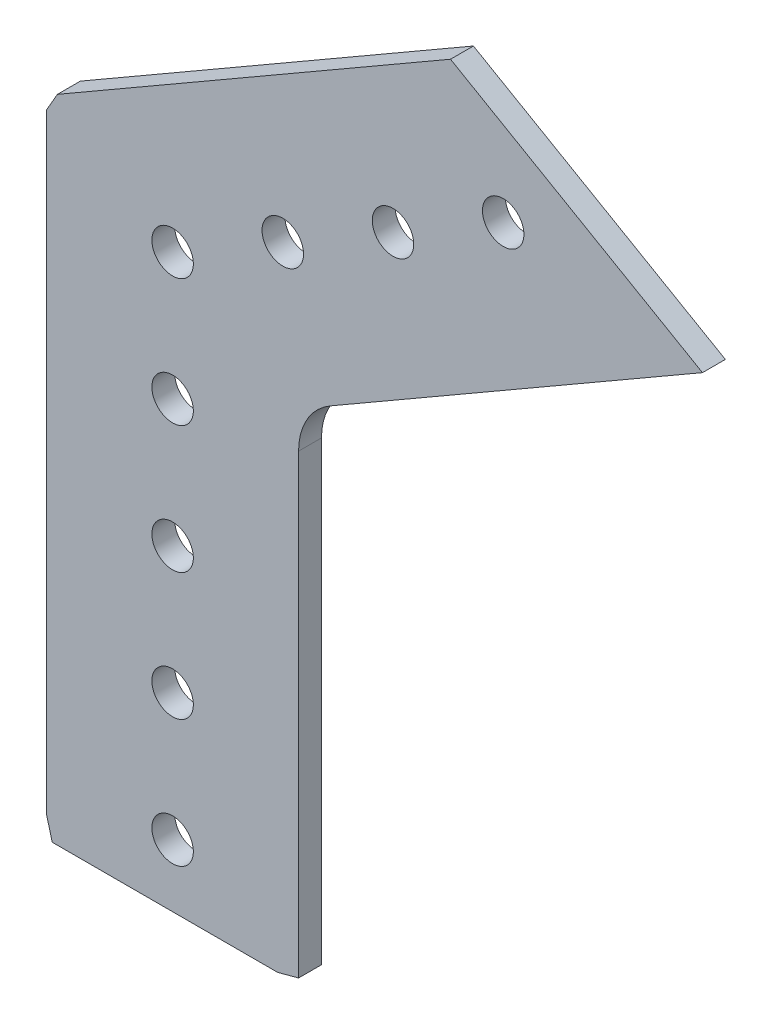
ISO-10303-21;
HEADER;
FILE_DESCRIPTION(('STEP AP214'),'2;1');
FILE_NAME('part.step','',(''),(''),'','','');
FILE_SCHEMA(('AUTOMOTIVE_DESIGN { 1 0 10303 214 1 1 1 1 }'));
ENDSEC;
DATA;
#1=APPLICATION_CONTEXT('core data for automotive mechanical design processes');
#2=APPLICATION_PROTOCOL_DEFINITION('international standard','automotive_design',2000,#1);
#3=PRODUCT_CONTEXT('',#1,'mechanical');
#4=PRODUCT('Part','Part','',(#3));
#5=PRODUCT_RELATED_PRODUCT_CATEGORY('part','',(#4));
#6=PRODUCT_DEFINITION_FORMATION('','',#4);
#7=PRODUCT_DEFINITION_CONTEXT('part definition',#1,'design');
#8=PRODUCT_DEFINITION('design','',#6,#7);
#9=PRODUCT_DEFINITION_SHAPE('','',#8);
#10=(LENGTH_UNIT() NAMED_UNIT(*) SI_UNIT(.MILLI.,.METRE.));
#11=(NAMED_UNIT(*) PLANE_ANGLE_UNIT() SI_UNIT($,.RADIAN.));
#12=(NAMED_UNIT(*) SI_UNIT($,.STERADIAN.) SOLID_ANGLE_UNIT());
#13=UNCERTAINTY_MEASURE_WITH_UNIT(LENGTH_MEASURE(1.E-05),#10,'distance_accuracy_value','');
#14=(GEOMETRIC_REPRESENTATION_CONTEXT(3) GLOBAL_UNCERTAINTY_ASSIGNED_CONTEXT((#13)) GLOBAL_UNIT_ASSIGNED_CONTEXT((#10,
#11,#12)) REPRESENTATION_CONTEXT('',''));
#15=CARTESIAN_POINT('',(0.,0.,0.));
#16=DIRECTION('',(0.,0.,1.));
#17=DIRECTION('',(1.,0.,0.));
#18=AXIS2_PLACEMENT_3D('',#15,#16,#17);
#19=CARTESIAN_POINT('',(0.,0.,2.286));
#20=DIRECTION('',(0.,0.,1.));
#21=DIRECTION('',(1.,0.,0.));
#22=AXIS2_PLACEMENT_3D('',#19,#20,#21);
#23=PLANE('',#22);
#24=CARTESIAN_POINT('',(21.9970452561238,12.7,2.286));
#25=DIRECTION('',(0.,0.,-1.));
#26=DIRECTION('',(-1.,0.,0.));
#27=AXIS2_PLACEMENT_3D('',#24,#25,#26);
#28=CIRCLE('',#27,2.0701);
#29=CARTESIAN_POINT('',(19.9269452561238,12.7,2.286));
#30=VERTEX_POINT('',#29);
#31=EDGE_CURVE('E183',#30,#30,#28,.T.);
#32=ORIENTED_EDGE('',*,*,#31,.T.);
#33=EDGE_LOOP('',(#32));
#34=FACE_BOUND('',#33,.T.);
#35=CARTESIAN_POINT('',(0.,0.,2.286));
#36=DIRECTION('',(0.,0.,-1.));
#37=DIRECTION('',(-1.,0.,0.));
#38=AXIS2_PLACEMENT_3D('',#35,#36,#37);
#39=CIRCLE('',#38,2.0701);
#40=CARTESIAN_POINT('',(-2.0701,0.,2.286));
#41=VERTEX_POINT('',#40);
#42=EDGE_CURVE('E186',#41,#41,#39,.T.);
#43=ORIENTED_EDGE('',*,*,#42,.T.);
#44=EDGE_LOOP('',(#43));
#45=FACE_BOUND('',#44,.T.);
#46=CARTESIAN_POINT('',(3.99076317029666E-13,-38.1,2.286));
#47=DIRECTION('',(0.,0.,-1.));
#48=DIRECTION('',(-1.,0.,0.));
#49=AXIS2_PLACEMENT_3D('',#46,#47,#48);
#50=CIRCLE('',#49,2.0701);
#51=CARTESIAN_POINT('',(-2.0700999999996,-38.1,2.286));
#52=VERTEX_POINT('',#51);
#53=EDGE_CURVE('E189',#52,#52,#50,.T.);
#54=ORIENTED_EDGE('',*,*,#53,.T.);
#55=EDGE_LOOP('',(#54));
#56=FACE_BOUND('',#55,.T.);
#57=CARTESIAN_POINT('',(0.,-12.7,2.286));
#58=DIRECTION('',(0.,0.,-1.));
#59=DIRECTION('',(-1.,0.,0.));
#60=AXIS2_PLACEMENT_3D('',#57,#58,#59);
#61=CIRCLE('',#60,2.0701);
#62=CARTESIAN_POINT('',(-2.0701,-12.7,2.286));
#63=VERTEX_POINT('',#62);
#64=EDGE_CURVE('E192',#63,#63,#61,.T.);
#65=ORIENTED_EDGE('',*,*,#64,.T.);
#66=EDGE_LOOP('',(#65));
#67=FACE_BOUND('',#66,.T.);
#68=CARTESIAN_POINT('',(2.66050878019862E-13,-25.4,2.286));
#69=DIRECTION('',(0.,0.,-1.));
#70=DIRECTION('',(-1.,0.,0.));
#71=AXIS2_PLACEMENT_3D('',#68,#69,#70);
#72=CIRCLE('',#71,2.0701);
#73=CARTESIAN_POINT('',(-2.07009999999973,-25.4,2.286));
#74=VERTEX_POINT('',#73);
#75=EDGE_CURVE('E195',#74,#74,#72,.T.);
#76=ORIENTED_EDGE('',*,*,#75,.T.);
#77=EDGE_LOOP('',(#76));
#78=FACE_BOUND('',#77,.T.);
#79=CARTESIAN_POINT('',(0.,-50.8,2.286));
#80=DIRECTION('',(0.,0.,-1.));
#81=DIRECTION('',(-1.,0.,0.));
#82=AXIS2_PLACEMENT_3D('',#79,#80,#81);
#83=CIRCLE('',#82,2.0701);
#84=CARTESIAN_POINT('',(-2.0701,-50.8,2.286));
#85=VERTEX_POINT('',#84);
#86=EDGE_CURVE('E198',#85,#85,#83,.T.);
#87=ORIENTED_EDGE('',*,*,#86,.T.);
#88=EDGE_LOOP('',(#87));
#89=FACE_BOUND('',#88,.T.);
#90=CARTESIAN_POINT('',(32.9955678841958,19.05,2.286));
#91=DIRECTION('',(0.,0.,-1.));
#92=DIRECTION('',(-1.,0.,0.));
#93=AXIS2_PLACEMENT_3D('',#90,#91,#92);
#94=CIRCLE('',#93,2.0701);
#95=CARTESIAN_POINT('',(30.9254678841958,19.05,2.286));
#96=VERTEX_POINT('',#95);
#97=EDGE_CURVE('E201',#96,#96,#94,.T.);
#98=ORIENTED_EDGE('',*,*,#97,.T.);
#99=EDGE_LOOP('',(#98));
#100=FACE_BOUND('',#99,.T.);
#101=CARTESIAN_POINT('',(10.9985226280619,6.35,2.286));
#102=DIRECTION('',(0.,0.,-1.));
#103=DIRECTION('',(-1.,0.,0.));
#104=AXIS2_PLACEMENT_3D('',#101,#102,#103);
#105=CIRCLE('',#104,2.0701);
#106=CARTESIAN_POINT('',(8.92842262806188,6.35,2.286));
#107=VERTEX_POINT('',#106);
#108=EDGE_CURVE('E123',#107,#107,#105,.T.);
#109=ORIENTED_EDGE('',*,*,#108,.T.);
#110=EDGE_LOOP('',(#109));
#111=FACE_BOUND('',#110,.T.);
#112=DIRECTION('',(-0.866025403784429,-0.500000000000017,0.));
#113=VECTOR('',#112,1.);
#114=CARTESIAN_POINT('',(12.573,-7.25902493452206,2.286));
#115=LINE('',#114,#113);
#116=CARTESIAN_POINT('',(15.7479999999999,-5.42593782984496,2.286));
#117=VERTEX_POINT('',#116);
#118=CARTESIAN_POINT('',(52.8832839420883,16.0141283505576,2.286));
#119=VERTEX_POINT('',#118);
#120=EDGE_CURVE('E97',#117,#119,#115,.F.);
#121=ORIENTED_EDGE('',*,*,#120,.T.);
#122=DIRECTION('',(0.866025403784429,-0.500000000000017,0.));
#123=VECTOR('',#122,1.);
#124=CARTESIAN_POINT('',(62.2844715234926,10.5863501697414,2.286));
#125=LINE('',#124,#123);
#126=CARTESIAN_POINT('',(27.73728394209,30.5321782195957,2.286));
#127=VERTEX_POINT('',#126);
#128=EDGE_CURVE('E93',#119,#127,#125,.F.);
#129=ORIENTED_EDGE('',*,*,#128,.T.);
#130=DIRECTION('',(0.866025403784429,0.500000000000017,0.));
#131=VECTOR('',#130,1.);
#132=CARTESIAN_POINT('',(43.0968665999984,39.4000374017742,2.286));
#133=LINE('',#132,#131);
#134=CARTESIAN_POINT('',(-11.4934999999996,7.88227455010915,2.286));
#135=VERTEX_POINT('',#134);
#136=EDGE_CURVE('E95',#127,#135,#133,.F.);
#137=ORIENTED_EDGE('',*,*,#136,.T.);
#138=DIRECTION('',(0.500000000000017,0.866025403784429,0.));
#139=VECTOR('',#138,1.);
#140=CARTESIAN_POINT('',(-12.573,6.01252570334212,2.286));
#141=LINE('',#140,#139);
#142=CARTESIAN_POINT('',(-12.573,6.01252570334212,2.286));
#143=VERTEX_POINT('',#142);
#144=EDGE_CURVE('E109',#135,#143,#141,.F.);
#145=ORIENTED_EDGE('',*,*,#144,.T.);
#146=DIRECTION('',(0.,1.,0.));
#147=VECTOR('',#146,1.);
#148=CARTESIAN_POINT('',(-12.573,-57.023,2.286));
#149=LINE('',#148,#147);
#150=CARTESIAN_POINT('',(-12.573,-54.937566141031,2.286));
#151=VERTEX_POINT('',#150);
#152=EDGE_CURVE('E145',#143,#151,#149,.F.);
#153=ORIENTED_EDGE('',*,*,#152,.T.);
#154=DIRECTION('',(-0.258819045102493,0.965925826289076,0.));
#155=VECTOR('',#154,1.);
#156=CARTESIAN_POINT('',(-12.573,-54.937566141031,2.286));
#157=LINE('',#156,#155);
#158=CARTESIAN_POINT('',(-12.014209681623,-57.0229999999997,2.286));
#159=VERTEX_POINT('',#158);
#160=EDGE_CURVE('E142',#151,#159,#157,.F.);
#161=ORIENTED_EDGE('',*,*,#160,.T.);
#162=DIRECTION('',(1.,0.,0.));
#163=VECTOR('',#162,1.);
#164=CARTESIAN_POINT('',(12.573,-57.023,2.286));
#165=LINE('',#164,#163);
#166=CARTESIAN_POINT('',(10.4875661410412,-57.023,2.286));
#167=VERTEX_POINT('',#166);
#168=EDGE_CURVE('E135',#159,#167,#165,.T.);
#169=ORIENTED_EDGE('',*,*,#168,.T.);
#170=DIRECTION('',(-0.965925826289076,-0.258819045102493,0.));
#171=VECTOR('',#170,1.);
#172=CARTESIAN_POINT('',(10.4875661410412,-57.023,2.286));
#173=LINE('',#172,#171);
#174=CARTESIAN_POINT('',(12.5730000000006,-56.4642096816186,2.286));
#175=VERTEX_POINT('',#174);
#176=EDGE_CURVE('E54',#167,#175,#173,.F.);
#177=ORIENTED_EDGE('',*,*,#176,.T.);
#178=DIRECTION('',(0.,1.,0.));
#179=VECTOR('',#178,1.);
#180=CARTESIAN_POINT('',(12.573,-7.25902493452206,2.286));
#181=LINE('',#180,#179);
#182=CARTESIAN_POINT('',(12.573,-10.925199143876,2.286));
#183=VERTEX_POINT('',#182);
#184=EDGE_CURVE('E128',#175,#183,#181,.T.);
#185=ORIENTED_EDGE('',*,*,#184,.T.);
#186=CARTESIAN_POINT('',(18.923,-10.925199143876,2.286));
#187=DIRECTION('',(0.,0.,1.));
#188=DIRECTION('',(1.,0.,0.));
#189=AXIS2_PLACEMENT_3D('',#186,#187,#188);
#190=CIRCLE('',#189,6.35);
#191=EDGE_CURVE('E19',#183,#117,#190,.F.);
#192=ORIENTED_EDGE('',*,*,#191,.T.);
#193=EDGE_LOOP('',(#121,#129,#137,#145,#153,#161,#169,#177,#185,#192));
#194=FACE_BOUND('',#193,.T.);
#195=ADVANCED_FACE('F16',(#34,#45,#56,#67,#78,#89,#100,#111,#194),#23,.T.);
#196=CARTESIAN_POINT('',(62.2844715234926,10.5863501697414,0.));
#197=DIRECTION('',(-0.500000000000017,-0.866025403784429,0.));
#198=DIRECTION('',(0.866025403784429,-0.500000000000017,0.));
#199=AXIS2_PLACEMENT_3D('',#196,#197,#198);
#200=PLANE('',#199);
#201=DIRECTION('',(-0.866025403784488,0.499999999999915,0.));
#202=VECTOR('',#201,1.);
#203=CARTESIAN_POINT('',(52.8832839420852,16.0141283505566,0.));
#204=LINE('',#203,#202);
#205=CARTESIAN_POINT('',(52.8832839420858,16.0141283505554,0.));
#206=VERTEX_POINT('',#205);
#207=CARTESIAN_POINT('',(27.7372839420864,30.5321782195935,0.));
#208=VERTEX_POINT('',#207);
#209=EDGE_CURVE('E114',#206,#208,#204,.T.);
#210=ORIENTED_EDGE('',*,*,#209,.T.);
#211=DIRECTION('',(0.,0.,1.));
#212=VECTOR('',#211,1.);
#213=CARTESIAN_POINT('',(27.7372839420888,30.5321782195894,2.286));
#214=LINE('',#213,#212);
#215=EDGE_CURVE('E102',#208,#127,#214,.T.);
#216=ORIENTED_EDGE('',*,*,#215,.T.);
#217=ORIENTED_EDGE('',*,*,#128,.F.);
#218=DIRECTION('',(0.,0.,1.));
#219=VECTOR('',#218,1.);
#220=CARTESIAN_POINT('',(52.8832839420871,16.0141283505532,2.286));
#221=LINE('',#220,#219);
#222=EDGE_CURVE('E335',#119,#206,#221,.F.);
#223=ORIENTED_EDGE('',*,*,#222,.T.);
#224=EDGE_LOOP('',(#210,#216,#217,#223));
#225=FACE_BOUND('',#224,.T.);
#226=ADVANCED_FACE('F112',(#225),#200,.F.);
#227=CARTESIAN_POINT('',(43.0968665999984,39.4000374017742,2.286));
#228=DIRECTION('',(0.500000000000017,-0.866025403784429,0.));
#229=DIRECTION('',(0.866025403784429,0.500000000000017,0.));
#230=AXIS2_PLACEMENT_3D('',#227,#228,#229);
#231=PLANE('',#230);
#232=DIRECTION('',(0.,0.,1.));
#233=VECTOR('',#232,1.);
#234=CARTESIAN_POINT('',(-11.4935000000008,7.88227455011123,2.286));
#235=LINE('',#234,#233);
#236=CARTESIAN_POINT('',(-11.4935000000003,7.8822745501109,0.));
#237=VERTEX_POINT('',#236);
#238=EDGE_CURVE('E108',#237,#135,#235,.T.);
#239=ORIENTED_EDGE('',*,*,#238,.T.);
#240=ORIENTED_EDGE('',*,*,#136,.F.);
#241=ORIENTED_EDGE('',*,*,#215,.F.);
#242=DIRECTION('',(-0.866025403784421,-0.500000000000031,0.));
#243=VECTOR('',#242,1.);
#244=CARTESIAN_POINT('',(27.7372839420852,30.5321782195956,0.));
#245=LINE('',#244,#243);
#246=EDGE_CURVE('E340',#208,#237,#245,.T.);
#247=ORIENTED_EDGE('',*,*,#246,.T.);
#248=EDGE_LOOP('',(#239,#240,#241,#247));
#249=FACE_BOUND('',#248,.T.);
#250=ADVANCED_FACE('F105',(#249),#231,.F.);
#251=CARTESIAN_POINT('',(-12.573,6.01252570334212,2.286));
#252=DIRECTION('',(0.866025403784429,-0.500000000000017,0.));
#253=DIRECTION('',(0.500000000000017,0.866025403784429,0.));
#254=AXIS2_PLACEMENT_3D('',#251,#252,#253);
#255=PLANE('',#254);
#256=DIRECTION('',(-0.500000000000393,-0.866025403784212,0.));
#257=VECTOR('',#256,1.);
#258=CARTESIAN_POINT('',(-11.4935,7.88227455011076,0.));
#259=LINE('',#258,#257);
#260=CARTESIAN_POINT('',(-12.573,6.01252570334212,0.));
#261=VERTEX_POINT('',#260);
#262=EDGE_CURVE('E373',#237,#261,#259,.T.);
#263=ORIENTED_EDGE('',*,*,#262,.T.);
#264=DIRECTION('',(0.,0.,-1.));
#265=VECTOR('',#264,1.);
#266=CARTESIAN_POINT('',(-12.573,6.01252570334212,2.286));
#267=LINE('',#266,#265);
#268=EDGE_CURVE('E150',#261,#143,#267,.F.);
#269=ORIENTED_EDGE('',*,*,#268,.T.);
#270=ORIENTED_EDGE('',*,*,#144,.F.);
#271=ORIENTED_EDGE('',*,*,#238,.F.);
#272=EDGE_LOOP('',(#263,#269,#270,#271));
#273=FACE_BOUND('',#272,.T.);
#274=ADVANCED_FACE('F285',(#273),#255,.F.);
#275=CARTESIAN_POINT('',(-12.573,-57.023,2.286));
#276=DIRECTION('',(1.,0.,0.));
#277=DIRECTION('',(0.,0.,-1.));
#278=AXIS2_PLACEMENT_3D('',#275,#276,#277);
#279=PLANE('',#278);
#280=ORIENTED_EDGE('',*,*,#268,.F.);
#281=DIRECTION('',(0.,1.,0.));
#282=VECTOR('',#281,1.);
#283=CARTESIAN_POINT('',(-12.573,0.,0.));
#284=LINE('',#283,#282);
#285=CARTESIAN_POINT('',(-12.573,-54.9375661410309,0.));
#286=VERTEX_POINT('',#285);
#287=EDGE_CURVE('E364',#261,#286,#284,.F.);
#288=ORIENTED_EDGE('',*,*,#287,.T.);
#289=DIRECTION('',(0.,0.,1.));
#290=VECTOR('',#289,1.);
#291=CARTESIAN_POINT('',(-12.573,-54.937566141031,2.286));
#292=LINE('',#291,#290);
#293=EDGE_CURVE('E144',#286,#151,#292,.T.);
#294=ORIENTED_EDGE('',*,*,#293,.T.);
#295=ORIENTED_EDGE('',*,*,#152,.F.);
#296=EDGE_LOOP('',(#280,#288,#294,#295));
#297=FACE_BOUND('',#296,.T.);
#298=ADVANCED_FACE('F290',(#297),#279,.F.);
#299=CARTESIAN_POINT('',(-12.573,-54.937566141031,2.286));
#300=DIRECTION('',(0.965925826289076,0.258819045102493,0.));
#301=DIRECTION('',(-0.258819045102493,0.965925826289076,0.));
#302=AXIS2_PLACEMENT_3D('',#299,#300,#301);
#303=PLANE('',#302);
#304=DIRECTION('',(0.258819045101101,-0.965925826289449,0.));
#305=VECTOR('',#304,1.);
#306=CARTESIAN_POINT('',(-12.573,-54.937566141031,0.));
#307=LINE('',#306,#305);
#308=CARTESIAN_POINT('',(-12.014209681624,-57.023,0.));
#309=VERTEX_POINT('',#308);
#310=EDGE_CURVE('E355',#286,#309,#307,.T.);
#311=ORIENTED_EDGE('',*,*,#310,.T.);
#312=DIRECTION('',(0.,0.,1.));
#313=VECTOR('',#312,1.);
#314=CARTESIAN_POINT('',(-12.014209681624,-57.023,2.286));
#315=LINE('',#314,#313);
#316=EDGE_CURVE('E139',#309,#159,#315,.T.);
#317=ORIENTED_EDGE('',*,*,#316,.T.);
#318=ORIENTED_EDGE('',*,*,#160,.F.);
#319=ORIENTED_EDGE('',*,*,#293,.F.);
#320=EDGE_LOOP('',(#311,#317,#318,#319));
#321=FACE_BOUND('',#320,.T.);
#322=ADVANCED_FACE('F294',(#321),#303,.F.);
#323=CARTESIAN_POINT('',(12.573,-57.023,2.286));
#324=DIRECTION('',(0.,1.,0.));
#325=DIRECTION('',(0.,0.,1.));
#326=AXIS2_PLACEMENT_3D('',#323,#324,#325);
#327=PLANE('',#326);
#328=DIRECTION('',(0.,0.,1.));
#329=VECTOR('',#328,1.);
#330=CARTESIAN_POINT('',(10.4875661410412,-57.023,2.286));
#331=LINE('',#330,#329);
#332=CARTESIAN_POINT('',(10.4875661410412,-57.023,0.));
#333=VERTEX_POINT('',#332);
#334=EDGE_CURVE('E134',#333,#167,#331,.T.);
#335=ORIENTED_EDGE('',*,*,#334,.T.);
#336=ORIENTED_EDGE('',*,*,#168,.F.);
#337=ORIENTED_EDGE('',*,*,#316,.F.);
#338=DIRECTION('',(1.,0.,0.));
#339=VECTOR('',#338,1.);
#340=CARTESIAN_POINT('',(0.,-57.023,0.));
#341=LINE('',#340,#339);
#342=EDGE_CURVE('E326',#309,#333,#341,.T.);
#343=ORIENTED_EDGE('',*,*,#342,.T.);
#344=EDGE_LOOP('',(#335,#336,#337,#343));
#345=FACE_BOUND('',#344,.T.);
#346=ADVANCED_FACE('F298',(#345),#327,.F.);
#347=CARTESIAN_POINT('',(10.4875661410412,-57.023,2.286));
#348=DIRECTION('',(-0.258819045102493,0.965925826289076,0.));
#349=DIRECTION('',(-0.965925826289076,-0.258819045102493,0.));
#350=AXIS2_PLACEMENT_3D('',#347,#348,#349);
#351=PLANE('',#350);
#352=DIRECTION('',(0.965925826288251,0.258819045105572,0.));
#353=VECTOR('',#352,1.);
#354=CARTESIAN_POINT('',(10.4875661410412,-57.023,0.));
#355=LINE('',#354,#353);
#356=CARTESIAN_POINT('',(12.573,-56.4642096816164,0.));
#357=VERTEX_POINT('',#356);
#358=EDGE_CURVE('E324',#333,#357,#355,.T.);
#359=ORIENTED_EDGE('',*,*,#358,.T.);
#360=DIRECTION('',(0.,0.,1.));
#361=VECTOR('',#360,1.);
#362=CARTESIAN_POINT('',(12.573,-56.4642096816164,2.286));
#363=LINE('',#362,#361);
#364=EDGE_CURVE('E130',#357,#175,#363,.T.);
#365=ORIENTED_EDGE('',*,*,#364,.T.);
#366=ORIENTED_EDGE('',*,*,#176,.F.);
#367=ORIENTED_EDGE('',*,*,#334,.F.);
#368=EDGE_LOOP('',(#359,#365,#366,#367));
#369=FACE_BOUND('',#368,.T.);
#370=ADVANCED_FACE('F302',(#369),#351,.F.);
#371=CARTESIAN_POINT('',(12.573,-7.25902493452206,2.286));
#372=DIRECTION('',(-1.,0.,0.));
#373=DIRECTION('',(0.,0.,1.));
#374=AXIS2_PLACEMENT_3D('',#371,#372,#373);
#375=PLANE('',#374);
#376=DIRECTION('',(0.,0.,1.));
#377=VECTOR('',#376,1.);
#378=CARTESIAN_POINT('',(12.573,-10.925199143876,2.286));
#379=LINE('',#378,#377);
#380=CARTESIAN_POINT('',(12.573,-10.925199143876,0.));
#381=VERTEX_POINT('',#380);
#382=EDGE_CURVE('E316',#381,#183,#379,.T.);
#383=ORIENTED_EDGE('',*,*,#382,.T.);
#384=ORIENTED_EDGE('',*,*,#184,.F.);
#385=ORIENTED_EDGE('',*,*,#364,.F.);
#386=DIRECTION('',(0.,1.,0.));
#387=VECTOR('',#386,1.);
#388=CARTESIAN_POINT('',(12.573,0.,0.));
#389=LINE('',#388,#387);
#390=EDGE_CURVE('E182',#357,#381,#389,.T.);
#391=ORIENTED_EDGE('',*,*,#390,.T.);
#392=EDGE_LOOP('',(#383,#384,#385,#391));
#393=FACE_BOUND('',#392,.T.);
#394=ADVANCED_FACE('F306',(#393),#375,.F.);
#395=CARTESIAN_POINT('',(18.923,-10.925199143876,2.286));
#396=DIRECTION('',(0.,0.,1.));
#397=DIRECTION('',(1.,0.,0.));
#398=AXIS2_PLACEMENT_3D('',#395,#396,#397);
#399=CYLINDRICAL_SURFACE('',#398,6.35);
#400=CARTESIAN_POINT('',(18.923,-10.925199143876,0.));
#401=DIRECTION('',(0.,0.,1.));
#402=DIRECTION('',(1.,0.,0.));
#403=AXIS2_PLACEMENT_3D('',#400,#401,#402);
#404=CIRCLE('',#403,6.35);
#405=CARTESIAN_POINT('',(15.7479999999997,-5.42593782984517,0.));
#406=VERTEX_POINT('',#405);
#407=EDGE_CURVE('E179',#381,#406,#404,.F.);
#408=ORIENTED_EDGE('',*,*,#407,.T.);
#409=DIRECTION('',(0.,0.,1.));
#410=VECTOR('',#409,1.);
#411=CARTESIAN_POINT('',(15.7479999999999,-5.42593782984496,2.286));
#412=LINE('',#411,#410);
#413=EDGE_CURVE('E34',#406,#117,#412,.T.);
#414=ORIENTED_EDGE('',*,*,#413,.T.);
#415=ORIENTED_EDGE('',*,*,#191,.F.);
#416=ORIENTED_EDGE('',*,*,#382,.F.);
#417=EDGE_LOOP('',(#408,#414,#415,#416));
#418=FACE_BOUND('',#417,.T.);
#419=ADVANCED_FACE('F221',(#418),#399,.F.);
#420=CARTESIAN_POINT('',(12.573,-7.25902493452206,2.286));
#421=DIRECTION('',(-0.500000000000017,0.866025403784429,0.));
#422=DIRECTION('',(-0.866025403784429,-0.500000000000017,0.));
#423=AXIS2_PLACEMENT_3D('',#420,#421,#422);
#424=PLANE('',#423);
#425=ORIENTED_EDGE('',*,*,#413,.F.);
#426=DIRECTION('',(0.866025403784383,0.500000000000097,0.));
#427=VECTOR('',#426,1.);
#428=CARTESIAN_POINT('',(15.748,-5.42593782984508,0.));
#429=LINE('',#428,#427);
#430=EDGE_CURVE('E178',#406,#206,#429,.T.);
#431=ORIENTED_EDGE('',*,*,#430,.T.);
#432=ORIENTED_EDGE('',*,*,#222,.F.);
#433=ORIENTED_EDGE('',*,*,#120,.F.);
#434=EDGE_LOOP('',(#425,#431,#432,#433));
#435=FACE_BOUND('',#434,.T.);
#436=ADVANCED_FACE('F210',(#435),#424,.F.);
#437=CARTESIAN_POINT('',(10.9985226280619,6.35,2.286));
#438=DIRECTION('',(0.,0.,-1.));
#439=DIRECTION('',(-1.,0.,0.));
#440=AXIS2_PLACEMENT_3D('',#437,#438,#439);
#441=CYLINDRICAL_SURFACE('',#440,2.0701);
#442=CARTESIAN_POINT('',(10.9985226280619,6.35,0.));
#443=DIRECTION('',(0.,0.,-1.));
#444=DIRECTION('',(-1.,0.,0.));
#445=AXIS2_PLACEMENT_3D('',#442,#443,#444);
#446=CIRCLE('',#445,2.0701);
#447=CARTESIAN_POINT('',(8.92842262806188,6.35,0.));
#448=VERTEX_POINT('',#447);
#449=EDGE_CURVE('E175',#448,#448,#446,.T.);
#450=ORIENTED_EDGE('',*,*,#449,.T.);
#451=EDGE_LOOP('',(#450));
#452=FACE_BOUND('',#451,.T.);
#453=ORIENTED_EDGE('',*,*,#108,.F.);
#454=EDGE_LOOP('',(#453));
#455=FACE_BOUND('',#454,.T.);
#456=ADVANCED_FACE('F207',(#452,#455),#441,.F.);
#457=CARTESIAN_POINT('',(32.9955678841958,19.05,2.286));
#458=DIRECTION('',(0.,0.,-1.));
#459=DIRECTION('',(-1.,0.,0.));
#460=AXIS2_PLACEMENT_3D('',#457,#458,#459);
#461=CYLINDRICAL_SURFACE('',#460,2.0701);
#462=CARTESIAN_POINT('',(32.9955678841958,19.05,0.));
#463=DIRECTION('',(0.,0.,-1.));
#464=DIRECTION('',(-1.,0.,0.));
#465=AXIS2_PLACEMENT_3D('',#462,#463,#464);
#466=CIRCLE('',#465,2.0701);
#467=CARTESIAN_POINT('',(30.9254678841958,19.05,0.));
#468=VERTEX_POINT('',#467);
#469=EDGE_CURVE('E172',#468,#468,#466,.T.);
#470=ORIENTED_EDGE('',*,*,#469,.T.);
#471=EDGE_LOOP('',(#470));
#472=FACE_BOUND('',#471,.T.);
#473=ORIENTED_EDGE('',*,*,#97,.F.);
#474=EDGE_LOOP('',(#473));
#475=FACE_BOUND('',#474,.T.);
#476=ADVANCED_FACE('F209',(#472,#475),#461,.F.);
#477=CARTESIAN_POINT('',(0.,-50.8,2.286));
#478=DIRECTION('',(0.,0.,-1.));
#479=DIRECTION('',(-1.,0.,0.));
#480=AXIS2_PLACEMENT_3D('',#477,#478,#479);
#481=CYLINDRICAL_SURFACE('',#480,2.0701);
#482=CARTESIAN_POINT('',(0.,-50.8,0.));
#483=DIRECTION('',(0.,0.,-1.));
#484=DIRECTION('',(-1.,0.,0.));
#485=AXIS2_PLACEMENT_3D('',#482,#483,#484);
#486=CIRCLE('',#485,2.0701);
#487=CARTESIAN_POINT('',(-2.0701,-50.8,0.));
#488=VERTEX_POINT('',#487);
#489=EDGE_CURVE('E169',#488,#488,#486,.T.);
#490=ORIENTED_EDGE('',*,*,#489,.T.);
#491=EDGE_LOOP('',(#490));
#492=FACE_BOUND('',#491,.T.);
#493=ORIENTED_EDGE('',*,*,#86,.F.);
#494=EDGE_LOOP('',(#493));
#495=FACE_BOUND('',#494,.T.);
#496=ADVANCED_FACE('F218',(#492,#495),#481,.F.);
#497=CARTESIAN_POINT('',(2.66050878019862E-13,-25.4,2.286));
#498=DIRECTION('',(0.,0.,-1.));
#499=DIRECTION('',(-1.,0.,0.));
#500=AXIS2_PLACEMENT_3D('',#497,#498,#499);
#501=CYLINDRICAL_SURFACE('',#500,2.0701);
#502=CARTESIAN_POINT('',(2.66050878019862E-13,-25.4,0.));
#503=DIRECTION('',(0.,0.,-1.));
#504=DIRECTION('',(-1.,0.,0.));
#505=AXIS2_PLACEMENT_3D('',#502,#503,#504);
#506=CIRCLE('',#505,2.0701);
#507=CARTESIAN_POINT('',(-2.07009999999973,-25.4,0.));
#508=VERTEX_POINT('',#507);
#509=EDGE_CURVE('E166',#508,#508,#506,.T.);
#510=ORIENTED_EDGE('',*,*,#509,.T.);
#511=EDGE_LOOP('',(#510));
#512=FACE_BOUND('',#511,.T.);
#513=ORIENTED_EDGE('',*,*,#75,.F.);
#514=EDGE_LOOP('',(#513));
#515=FACE_BOUND('',#514,.T.);
#516=ADVANCED_FACE('F247',(#512,#515),#501,.F.);
#517=CARTESIAN_POINT('',(0.,-12.7,2.286));
#518=DIRECTION('',(0.,0.,-1.));
#519=DIRECTION('',(-1.,0.,0.));
#520=AXIS2_PLACEMENT_3D('',#517,#518,#519);
#521=CYLINDRICAL_SURFACE('',#520,2.0701);
#522=CARTESIAN_POINT('',(0.,-12.7,0.));
#523=DIRECTION('',(0.,0.,-1.));
#524=DIRECTION('',(-1.,0.,0.));
#525=AXIS2_PLACEMENT_3D('',#522,#523,#524);
#526=CIRCLE('',#525,2.0701);
#527=CARTESIAN_POINT('',(-2.0701,-12.7,0.));
#528=VERTEX_POINT('',#527);
#529=EDGE_CURVE('E163',#528,#528,#526,.T.);
#530=ORIENTED_EDGE('',*,*,#529,.T.);
#531=EDGE_LOOP('',(#530));
#532=FACE_BOUND('',#531,.T.);
#533=ORIENTED_EDGE('',*,*,#64,.F.);
#534=EDGE_LOOP('',(#533));
#535=FACE_BOUND('',#534,.T.);
#536=ADVANCED_FACE('F243',(#532,#535),#521,.F.);
#537=CARTESIAN_POINT('',(3.99076317029666E-13,-38.1,2.286));
#538=DIRECTION('',(0.,0.,-1.));
#539=DIRECTION('',(-1.,0.,0.));
#540=AXIS2_PLACEMENT_3D('',#537,#538,#539);
#541=CYLINDRICAL_SURFACE('',#540,2.0701);
#542=CARTESIAN_POINT('',(3.99076317029666E-13,-38.1,0.));
#543=DIRECTION('',(0.,0.,-1.));
#544=DIRECTION('',(-1.,0.,0.));
#545=AXIS2_PLACEMENT_3D('',#542,#543,#544);
#546=CIRCLE('',#545,2.0701);
#547=CARTESIAN_POINT('',(-2.0700999999996,-38.1,0.));
#548=VERTEX_POINT('',#547);
#549=EDGE_CURVE('E160',#548,#548,#546,.T.);
#550=ORIENTED_EDGE('',*,*,#549,.T.);
#551=EDGE_LOOP('',(#550));
#552=FACE_BOUND('',#551,.T.);
#553=ORIENTED_EDGE('',*,*,#53,.F.);
#554=EDGE_LOOP('',(#553));
#555=FACE_BOUND('',#554,.T.);
#556=ADVANCED_FACE('F239',(#552,#555),#541,.F.);
#557=CARTESIAN_POINT('',(0.,0.,2.286));
#558=DIRECTION('',(0.,0.,-1.));
#559=DIRECTION('',(-1.,0.,0.));
#560=AXIS2_PLACEMENT_3D('',#557,#558,#559);
#561=CYLINDRICAL_SURFACE('',#560,2.0701);
#562=CARTESIAN_POINT('',(0.,0.,0.));
#563=DIRECTION('',(0.,0.,-1.));
#564=DIRECTION('',(-1.,0.,0.));
#565=AXIS2_PLACEMENT_3D('',#562,#563,#564);
#566=CIRCLE('',#565,2.0701);
#567=CARTESIAN_POINT('',(-2.0701,0.,0.));
#568=VERTEX_POINT('',#567);
#569=EDGE_CURVE('E25',#568,#568,#566,.T.);
#570=ORIENTED_EDGE('',*,*,#569,.T.);
#571=EDGE_LOOP('',(#570));
#572=FACE_BOUND('',#571,.T.);
#573=ORIENTED_EDGE('',*,*,#42,.F.);
#574=EDGE_LOOP('',(#573));
#575=FACE_BOUND('',#574,.T.);
#576=ADVANCED_FACE('F231',(#572,#575),#561,.F.);
#577=CARTESIAN_POINT('',(21.9970452561238,12.7,2.286));
#578=DIRECTION('',(0.,0.,-1.));
#579=DIRECTION('',(-1.,0.,0.));
#580=AXIS2_PLACEMENT_3D('',#577,#578,#579);
#581=CYLINDRICAL_SURFACE('',#580,2.0701);
#582=CARTESIAN_POINT('',(21.9970452561238,12.7,0.));
#583=DIRECTION('',(0.,0.,-1.));
#584=DIRECTION('',(-1.,0.,0.));
#585=AXIS2_PLACEMENT_3D('',#582,#583,#584);
#586=CIRCLE('',#585,2.0701);
#587=CARTESIAN_POINT('',(19.9269452561238,12.7,0.));
#588=VERTEX_POINT('',#587);
#589=EDGE_CURVE('E11',#588,#588,#586,.T.);
#590=ORIENTED_EDGE('',*,*,#589,.T.);
#591=EDGE_LOOP('',(#590));
#592=FACE_BOUND('',#591,.T.);
#593=ORIENTED_EDGE('',*,*,#31,.F.);
#594=EDGE_LOOP('',(#593));
#595=FACE_BOUND('',#594,.T.);
#596=ADVANCED_FACE('F225',(#592,#595),#581,.F.);
#597=CARTESIAN_POINT('',(0.,0.,0.));
#598=DIRECTION('',(0.,0.,1.));
#599=DIRECTION('',(1.,0.,0.));
#600=AXIS2_PLACEMENT_3D('',#597,#598,#599);
#601=PLANE('',#600);
#602=ORIENTED_EDGE('',*,*,#589,.F.);
#603=EDGE_LOOP('',(#602));
#604=FACE_BOUND('',#603,.T.);
#605=ORIENTED_EDGE('',*,*,#569,.F.);
#606=EDGE_LOOP('',(#605));
#607=FACE_BOUND('',#606,.T.);
#608=ORIENTED_EDGE('',*,*,#549,.F.);
#609=EDGE_LOOP('',(#608));
#610=FACE_BOUND('',#609,.T.);
#611=ORIENTED_EDGE('',*,*,#529,.F.);
#612=EDGE_LOOP('',(#611));
#613=FACE_BOUND('',#612,.T.);
#614=ORIENTED_EDGE('',*,*,#509,.F.);
#615=EDGE_LOOP('',(#614));
#616=FACE_BOUND('',#615,.T.);
#617=ORIENTED_EDGE('',*,*,#489,.F.);
#618=EDGE_LOOP('',(#617));
#619=FACE_BOUND('',#618,.T.);
#620=ORIENTED_EDGE('',*,*,#469,.F.);
#621=EDGE_LOOP('',(#620));
#622=FACE_BOUND('',#621,.T.);
#623=ORIENTED_EDGE('',*,*,#449,.F.);
#624=EDGE_LOOP('',(#623));
#625=FACE_BOUND('',#624,.T.);
#626=ORIENTED_EDGE('',*,*,#407,.F.);
#627=ORIENTED_EDGE('',*,*,#390,.F.);
#628=ORIENTED_EDGE('',*,*,#358,.F.);
#629=ORIENTED_EDGE('',*,*,#342,.F.);
#630=ORIENTED_EDGE('',*,*,#310,.F.);
#631=ORIENTED_EDGE('',*,*,#287,.F.);
#632=ORIENTED_EDGE('',*,*,#262,.F.);
#633=ORIENTED_EDGE('',*,*,#246,.F.);
#634=ORIENTED_EDGE('',*,*,#209,.F.);
#635=ORIENTED_EDGE('',*,*,#430,.F.);
#636=EDGE_LOOP('',(#626,#627,#628,#629,#630,#631,#632,#633,#634,#635));
#637=FACE_BOUND('',#636,.T.);
#638=ADVANCED_FACE('F223',(#604,#607,#610,#613,#616,#619,#622,#625,#637),#601,.F.);
#639=CLOSED_SHELL('',(#195,#226,#250,#274,#298,#322,#346,#370,#394,#419,#436,#456,#476,#496,
#516,#536,#556,#576,#596,#638));
#640=MANIFOLD_SOLID_BREP('B1',#639);
#641=ADVANCED_BREP_SHAPE_REPRESENTATION('',(#18,#640),#14);
#642=SHAPE_DEFINITION_REPRESENTATION(#9,#641);
ENDSEC;
END-ISO-10303-21;
